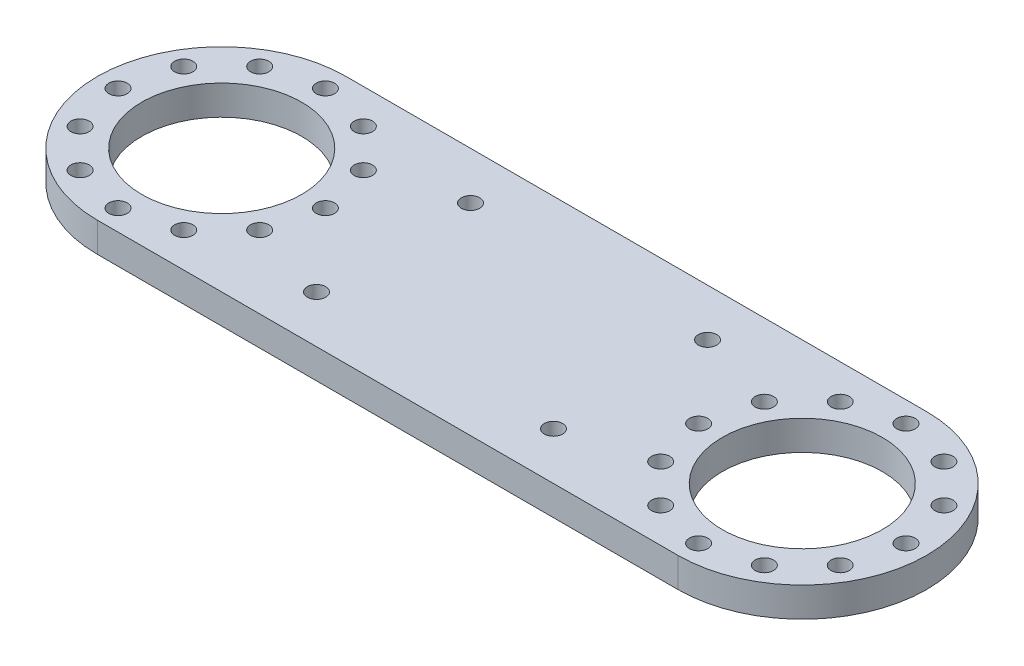
ISO-10303-21;
HEADER;
FILE_DESCRIPTION(('STEP AP214'),'2;1');
FILE_NAME('part.step','',(''),(''),'','','');
FILE_SCHEMA(('AUTOMOTIVE_DESIGN { 1 0 10303 214 1 1 1 1 }'));
ENDSEC;
DATA;
#1=APPLICATION_CONTEXT('core data for automotive mechanical design processes');
#2=APPLICATION_PROTOCOL_DEFINITION('international standard','automotive_design',2000,#1);
#3=PRODUCT_CONTEXT('',#1,'mechanical');
#4=PRODUCT('Part','Part','',(#3));
#5=PRODUCT_RELATED_PRODUCT_CATEGORY('part','',(#4));
#6=PRODUCT_DEFINITION_FORMATION('','',#4);
#7=PRODUCT_DEFINITION_CONTEXT('part definition',#1,'design');
#8=PRODUCT_DEFINITION('design','',#6,#7);
#9=PRODUCT_DEFINITION_SHAPE('','',#8);
#10=(LENGTH_UNIT() NAMED_UNIT(*) SI_UNIT(.MILLI.,.METRE.));
#11=(NAMED_UNIT(*) PLANE_ANGLE_UNIT() SI_UNIT($,.RADIAN.));
#12=(NAMED_UNIT(*) SI_UNIT($,.STERADIAN.) SOLID_ANGLE_UNIT());
#13=UNCERTAINTY_MEASURE_WITH_UNIT(LENGTH_MEASURE(1.E-05),#10,'distance_accuracy_value','');
#14=(GEOMETRIC_REPRESENTATION_CONTEXT(3) GLOBAL_UNCERTAINTY_ASSIGNED_CONTEXT((#13)) GLOBAL_UNIT_ASSIGNED_CONTEXT((#10,
#11,#12)) REPRESENTATION_CONTEXT('',''));
#15=CARTESIAN_POINT('',(0.,0.,0.));
#16=DIRECTION('',(0.,0.,1.));
#17=DIRECTION('',(1.,0.,0.));
#18=AXIS2_PLACEMENT_3D('',#15,#16,#17);
#19=CARTESIAN_POINT('',(-49.,5.,0.));
#20=DIRECTION('',(0.,1.,0.));
#21=DIRECTION('',(0.,0.,1.));
#22=AXIS2_PLACEMENT_3D('',#19,#20,#21);
#23=PLANE('',#22);
#24=CARTESIAN_POINT('',(49.,5.,0.));
#25=DIRECTION('',(0.,1.,0.));
#26=DIRECTION('',(0.,0.,-1.));
#27=AXIS2_PLACEMENT_3D('',#24,#25,#26);
#28=CIRCLE('',#27,13.5);
#29=CARTESIAN_POINT('',(49.,5.,-13.5));
#30=VERTEX_POINT('',#29);
#31=EDGE_CURVE('E281',#30,#30,#28,.T.);
#32=ORIENTED_EDGE('',*,*,#31,.F.);
#33=EDGE_LOOP('',(#32));
#34=FACE_BOUND('',#33,.T.);
#35=CARTESIAN_POINT('',(20.,5.,-13.));
#36=DIRECTION('',(0.,1.,0.));
#37=DIRECTION('',(0.,0.,-1.));
#38=AXIS2_PLACEMENT_3D('',#35,#36,#37);
#39=CIRCLE('',#38,1.55);
#40=CARTESIAN_POINT('',(20.,5.,-14.55));
#41=VERTEX_POINT('',#40);
#42=EDGE_CURVE('E269',#41,#41,#39,.T.);
#43=ORIENTED_EDGE('',*,*,#42,.F.);
#44=EDGE_LOOP('',(#43));
#45=FACE_BOUND('',#44,.T.);
#46=CARTESIAN_POINT('',(40.25,5.,-15.1554445662277));
#47=DIRECTION('',(0.,1.,0.));
#48=DIRECTION('',(0.,0.,-1.));
#49=AXIS2_PLACEMENT_3D('',#46,#47,#48);
#50=CIRCLE('',#49,1.55000000000001);
#51=CARTESIAN_POINT('',(40.25,5.,-16.7054445662277));
#52=VERTEX_POINT('',#51);
#53=EDGE_CURVE('E257',#52,#52,#50,.T.);
#54=ORIENTED_EDGE('',*,*,#53,.F.);
#55=EDGE_LOOP('',(#54));
#56=FACE_BOUND('',#55,.T.);
#57=CARTESIAN_POINT('',(33.8445554337723,5.,8.74999999999999));
#58=DIRECTION('',(0.,1.,0.));
#59=DIRECTION('',(0.,0.,-1.));
#60=AXIS2_PLACEMENT_3D('',#57,#58,#59);
#61=CIRCLE('',#60,1.55);
#62=CARTESIAN_POINT('',(33.8445554337723,5.,7.19999999999999));
#63=VERTEX_POINT('',#62);
#64=EDGE_CURVE('E245',#63,#63,#61,.T.);
#65=ORIENTED_EDGE('',*,*,#64,.F.);
#66=EDGE_LOOP('',(#65));
#67=FACE_BOUND('',#66,.T.);
#68=CARTESIAN_POINT('',(49.,5.,17.5));
#69=DIRECTION('',(0.,1.,0.));
#70=DIRECTION('',(0.,0.,-1.));
#71=AXIS2_PLACEMENT_3D('',#68,#69,#70);
#72=CIRCLE('',#71,1.54999999999999);
#73=CARTESIAN_POINT('',(49.,5.,15.95));
#74=VERTEX_POINT('',#73);
#75=EDGE_CURVE('E233',#74,#74,#72,.T.);
#76=ORIENTED_EDGE('',*,*,#75,.F.);
#77=EDGE_LOOP('',(#76));
#78=FACE_BOUND('',#77,.T.);
#79=CARTESIAN_POINT('',(64.1554445662277,5.,8.75000000000001));
#80=DIRECTION('',(0.,1.,0.));
#81=DIRECTION('',(0.,0.,-1.));
#82=AXIS2_PLACEMENT_3D('',#79,#80,#81);
#83=CIRCLE('',#82,1.55000000000001);
#84=CARTESIAN_POINT('',(64.1554445662277,5.,7.2));
#85=VERTEX_POINT('',#84);
#86=EDGE_CURVE('E221',#85,#85,#83,.T.);
#87=ORIENTED_EDGE('',*,*,#86,.F.);
#88=EDGE_LOOP('',(#87));
#89=FACE_BOUND('',#88,.T.);
#90=CARTESIAN_POINT('',(64.1554445662277,5.,-8.74999999999999));
#91=DIRECTION('',(0.,1.,0.));
#92=DIRECTION('',(0.,0.,-1.));
#93=AXIS2_PLACEMENT_3D('',#90,#91,#92);
#94=CIRCLE('',#93,1.55000000000001);
#95=CARTESIAN_POINT('',(64.1554445662277,5.,-10.3));
#96=VERTEX_POINT('',#95);
#97=EDGE_CURVE('E209',#96,#96,#94,.T.);
#98=ORIENTED_EDGE('',*,*,#97,.F.);
#99=EDGE_LOOP('',(#98));
#100=FACE_BOUND('',#99,.T.);
#101=CARTESIAN_POINT('',(-64.1554445662277,5.,-8.74999999999999));
#102=DIRECTION('',(0.,1.,0.));
#103=DIRECTION('',(0.,0.,1.));
#104=AXIS2_PLACEMENT_3D('',#101,#102,#103);
#105=CIRCLE('',#104,1.55000000000001);
#106=CARTESIAN_POINT('',(-64.1554445662277,5.,-7.19999999999998));
#107=VERTEX_POINT('',#106);
#108=EDGE_CURVE('E197',#107,#107,#105,.T.);
#109=ORIENTED_EDGE('',*,*,#108,.F.);
#110=EDGE_LOOP('',(#109));
#111=FACE_BOUND('',#110,.T.);
#112=CARTESIAN_POINT('',(-64.1554445662277,5.,8.75000000000001));
#113=DIRECTION('',(0.,1.,0.));
#114=DIRECTION('',(0.,0.,1.));
#115=AXIS2_PLACEMENT_3D('',#112,#113,#114);
#116=CIRCLE('',#115,1.55000000000001);
#117=CARTESIAN_POINT('',(-64.1554445662277,5.,10.3));
#118=VERTEX_POINT('',#117);
#119=EDGE_CURVE('E185',#118,#118,#116,.T.);
#120=ORIENTED_EDGE('',*,*,#119,.F.);
#121=EDGE_LOOP('',(#120));
#122=FACE_BOUND('',#121,.T.);
#123=CARTESIAN_POINT('',(-49.,5.,17.5));
#124=DIRECTION('',(0.,1.,0.));
#125=DIRECTION('',(0.,0.,1.));
#126=AXIS2_PLACEMENT_3D('',#123,#124,#125);
#127=CIRCLE('',#126,1.54999999999999);
#128=CARTESIAN_POINT('',(-49.,5.,19.05));
#129=VERTEX_POINT('',#128);
#130=EDGE_CURVE('E173',#129,#129,#127,.T.);
#131=ORIENTED_EDGE('',*,*,#130,.F.);
#132=EDGE_LOOP('',(#131));
#133=FACE_BOUND('',#132,.T.);
#134=CARTESIAN_POINT('',(-33.8445554337723,5.,8.74999999999999));
#135=DIRECTION('',(0.,1.,0.));
#136=DIRECTION('',(0.,0.,1.));
#137=AXIS2_PLACEMENT_3D('',#134,#135,#136);
#138=CIRCLE('',#137,1.55);
#139=CARTESIAN_POINT('',(-33.8445554337723,5.,10.3));
#140=VERTEX_POINT('',#139);
#141=EDGE_CURVE('E161',#140,#140,#138,.T.);
#142=ORIENTED_EDGE('',*,*,#141,.F.);
#143=EDGE_LOOP('',(#142));
#144=FACE_BOUND('',#143,.T.);
#145=CARTESIAN_POINT('',(-33.8445554337723,5.,-8.75000000000001));
#146=DIRECTION('',(0.,1.,0.));
#147=DIRECTION('',(0.,0.,1.));
#148=AXIS2_PLACEMENT_3D('',#145,#146,#147);
#149=CIRCLE('',#148,1.55);
#150=CARTESIAN_POINT('',(-33.8445554337723,5.,-7.20000000000001));
#151=VERTEX_POINT('',#150);
#152=EDGE_CURVE('E149',#151,#151,#149,.T.);
#153=ORIENTED_EDGE('',*,*,#152,.F.);
#154=EDGE_LOOP('',(#153));
#155=FACE_BOUND('',#154,.T.);
#156=CARTESIAN_POINT('',(57.75,5.,-15.1554445662277));
#157=DIRECTION('',(0.,1.,0.));
#158=DIRECTION('',(0.,0.,-1.));
#159=AXIS2_PLACEMENT_3D('',#156,#157,#158);
#160=CIRCLE('',#159,1.55);
#161=CARTESIAN_POINT('',(57.75,5.,-16.7054445662277));
#162=VERTEX_POINT('',#161);
#163=EDGE_CURVE('E137',#162,#162,#160,.T.);
#164=ORIENTED_EDGE('',*,*,#163,.F.);
#165=EDGE_LOOP('',(#164));
#166=FACE_BOUND('',#165,.T.);
#167=CARTESIAN_POINT('',(-20.,5.,-13.));
#168=DIRECTION('',(0.,1.,0.));
#169=DIRECTION('',(0.,0.,1.));
#170=AXIS2_PLACEMENT_3D('',#167,#168,#169);
#171=CIRCLE('',#170,1.55);
#172=CARTESIAN_POINT('',(-20.,5.,-11.45));
#173=VERTEX_POINT('',#172);
#174=EDGE_CURVE('E125',#173,#173,#171,.T.);
#175=ORIENTED_EDGE('',*,*,#174,.F.);
#176=EDGE_LOOP('',(#175));
#177=FACE_BOUND('',#176,.T.);
#178=CARTESIAN_POINT('',(-49.,5.,0.));
#179=DIRECTION('',(0.,1.,0.));
#180=DIRECTION('',(0.,0.,1.));
#181=AXIS2_PLACEMENT_3D('',#178,#179,#180);
#182=CIRCLE('',#181,13.5);
#183=CARTESIAN_POINT('',(-49.,5.,13.5));
#184=VERTEX_POINT('',#183);
#185=EDGE_CURVE('E104',#184,#184,#182,.T.);
#186=ORIENTED_EDGE('',*,*,#185,.F.);
#187=EDGE_LOOP('',(#186));
#188=FACE_BOUND('',#187,.T.);
#189=CARTESIAN_POINT('',(-49.,5.,0.));
#190=DIRECTION('',(0.,1.,0.));
#191=DIRECTION('',(0.,0.,1.));
#192=AXIS2_PLACEMENT_3D('',#189,#190,#191);
#193=CIRCLE('',#192,21.);
#194=CARTESIAN_POINT('',(-49.,5.,-21.));
#195=VERTEX_POINT('',#194);
#196=CARTESIAN_POINT('',(-49.,5.,21.));
#197=VERTEX_POINT('',#196);
#198=EDGE_CURVE('E89',#195,#197,#193,.T.);
#199=ORIENTED_EDGE('',*,*,#198,.T.);
#200=DIRECTION('',(1.,0.,0.));
#201=VECTOR('',#200,1.);
#202=CARTESIAN_POINT('',(-49.,5.,21.));
#203=LINE('',#202,#201);
#204=CARTESIAN_POINT('',(49.,5.,21.));
#205=VERTEX_POINT('',#204);
#206=EDGE_CURVE('E84',#197,#205,#203,.T.);
#207=ORIENTED_EDGE('',*,*,#206,.T.);
#208=CARTESIAN_POINT('',(49.,5.,0.));
#209=DIRECTION('',(0.,1.,0.));
#210=DIRECTION('',(0.,0.,1.));
#211=AXIS2_PLACEMENT_3D('',#208,#209,#210);
#212=CIRCLE('',#211,21.);
#213=CARTESIAN_POINT('',(49.,5.,-21.));
#214=VERTEX_POINT('',#213);
#215=EDGE_CURVE('E87',#205,#214,#212,.T.);
#216=ORIENTED_EDGE('',*,*,#215,.T.);
#217=DIRECTION('',(-1.,0.,0.));
#218=VECTOR('',#217,1.);
#219=CARTESIAN_POINT('',(-49.,5.,-21.));
#220=LINE('',#219,#218);
#221=EDGE_CURVE('E54',#214,#195,#220,.T.);
#222=ORIENTED_EDGE('',*,*,#221,.T.);
#223=EDGE_LOOP('',(#199,#207,#216,#222));
#224=FACE_BOUND('',#223,.T.);
#225=CARTESIAN_POINT('',(-49.,5.,-17.5));
#226=DIRECTION('',(0.,1.,0.));
#227=DIRECTION('',(0.,0.,1.));
#228=AXIS2_PLACEMENT_3D('',#225,#226,#227);
#229=CIRCLE('',#228,1.55);
#230=CARTESIAN_POINT('',(-49.,5.,-15.95));
#231=VERTEX_POINT('',#230);
#232=EDGE_CURVE('E119',#231,#231,#229,.T.);
#233=ORIENTED_EDGE('',*,*,#232,.F.);
#234=EDGE_LOOP('',(#233));
#235=FACE_BOUND('',#234,.T.);
#236=CARTESIAN_POINT('',(-20.,5.,13.));
#237=DIRECTION('',(0.,1.,0.));
#238=DIRECTION('',(0.,0.,1.));
#239=AXIS2_PLACEMENT_3D('',#236,#237,#238);
#240=CIRCLE('',#239,1.55);
#241=CARTESIAN_POINT('',(-20.,5.,14.55));
#242=VERTEX_POINT('',#241);
#243=EDGE_CURVE('E131',#242,#242,#240,.T.);
#244=ORIENTED_EDGE('',*,*,#243,.F.);
#245=EDGE_LOOP('',(#244));
#246=FACE_BOUND('',#245,.T.);
#247=CARTESIAN_POINT('',(-40.25,5.,-15.1554445662277));
#248=DIRECTION('',(0.,1.,0.));
#249=DIRECTION('',(0.,0.,1.));
#250=AXIS2_PLACEMENT_3D('',#247,#248,#249);
#251=CIRCLE('',#250,1.55000000000001);
#252=CARTESIAN_POINT('',(-40.25,5.,-13.6054445662277));
#253=VERTEX_POINT('',#252);
#254=EDGE_CURVE('E143',#253,#253,#251,.T.);
#255=ORIENTED_EDGE('',*,*,#254,.F.);
#256=EDGE_LOOP('',(#255));
#257=FACE_BOUND('',#256,.T.);
#258=CARTESIAN_POINT('',(-31.5,5.,0.));
#259=DIRECTION('',(0.,1.,0.));
#260=DIRECTION('',(0.,0.,1.));
#261=AXIS2_PLACEMENT_3D('',#258,#259,#260);
#262=CIRCLE('',#261,1.55);
#263=CARTESIAN_POINT('',(-31.5,5.,1.55));
#264=VERTEX_POINT('',#263);
#265=EDGE_CURVE('E155',#264,#264,#262,.T.);
#266=ORIENTED_EDGE('',*,*,#265,.F.);
#267=EDGE_LOOP('',(#266));
#268=FACE_BOUND('',#267,.T.);
#269=CARTESIAN_POINT('',(-40.25,5.,15.1554445662277));
#270=DIRECTION('',(0.,1.,0.));
#271=DIRECTION('',(0.,0.,1.));
#272=AXIS2_PLACEMENT_3D('',#269,#270,#271);
#273=CIRCLE('',#272,1.55);
#274=CARTESIAN_POINT('',(-40.25,5.,16.7054445662277));
#275=VERTEX_POINT('',#274);
#276=EDGE_CURVE('E167',#275,#275,#273,.T.);
#277=ORIENTED_EDGE('',*,*,#276,.F.);
#278=EDGE_LOOP('',(#277));
#279=FACE_BOUND('',#278,.T.);
#280=CARTESIAN_POINT('',(-57.75,5.,15.1554445662277));
#281=DIRECTION('',(0.,1.,0.));
#282=DIRECTION('',(0.,0.,1.));
#283=AXIS2_PLACEMENT_3D('',#280,#281,#282);
#284=CIRCLE('',#283,1.54999999999999);
#285=CARTESIAN_POINT('',(-57.75,5.,16.7054445662277));
#286=VERTEX_POINT('',#285);
#287=EDGE_CURVE('E179',#286,#286,#284,.T.);
#288=ORIENTED_EDGE('',*,*,#287,.F.);
#289=EDGE_LOOP('',(#288));
#290=FACE_BOUND('',#289,.T.);
#291=CARTESIAN_POINT('',(-66.5,5.,0.));
#292=DIRECTION('',(0.,1.,0.));
#293=DIRECTION('',(0.,0.,1.));
#294=AXIS2_PLACEMENT_3D('',#291,#292,#293);
#295=CIRCLE('',#294,1.54999999999999);
#296=CARTESIAN_POINT('',(-66.5,5.,1.54999999999999));
#297=VERTEX_POINT('',#296);
#298=EDGE_CURVE('E191',#297,#297,#295,.T.);
#299=ORIENTED_EDGE('',*,*,#298,.F.);
#300=EDGE_LOOP('',(#299));
#301=FACE_BOUND('',#300,.T.);
#302=CARTESIAN_POINT('',(-57.75,5.,-15.1554445662277));
#303=DIRECTION('',(0.,1.,0.));
#304=DIRECTION('',(0.,0.,1.));
#305=AXIS2_PLACEMENT_3D('',#302,#303,#304);
#306=CIRCLE('',#305,1.55);
#307=CARTESIAN_POINT('',(-57.75,5.,-13.6054445662277));
#308=VERTEX_POINT('',#307);
#309=EDGE_CURVE('E203',#308,#308,#306,.T.);
#310=ORIENTED_EDGE('',*,*,#309,.F.);
#311=EDGE_LOOP('',(#310));
#312=FACE_BOUND('',#311,.T.);
#313=CARTESIAN_POINT('',(66.5,5.,0.));
#314=DIRECTION('',(0.,1.,0.));
#315=DIRECTION('',(0.,0.,-1.));
#316=AXIS2_PLACEMENT_3D('',#313,#314,#315);
#317=CIRCLE('',#316,1.54999999999999);
#318=CARTESIAN_POINT('',(66.5,5.,-1.54999999999999));
#319=VERTEX_POINT('',#318);
#320=EDGE_CURVE('E215',#319,#319,#317,.T.);
#321=ORIENTED_EDGE('',*,*,#320,.F.);
#322=EDGE_LOOP('',(#321));
#323=FACE_BOUND('',#322,.T.);
#324=CARTESIAN_POINT('',(57.75,5.,15.1554445662277));
#325=DIRECTION('',(0.,1.,0.));
#326=DIRECTION('',(0.,0.,-1.));
#327=AXIS2_PLACEMENT_3D('',#324,#325,#326);
#328=CIRCLE('',#327,1.54999999999999);
#329=CARTESIAN_POINT('',(57.75,5.,13.6054445662277));
#330=VERTEX_POINT('',#329);
#331=EDGE_CURVE('E227',#330,#330,#328,.T.);
#332=ORIENTED_EDGE('',*,*,#331,.F.);
#333=EDGE_LOOP('',(#332));
#334=FACE_BOUND('',#333,.T.);
#335=CARTESIAN_POINT('',(40.25,5.,15.1554445662277));
#336=DIRECTION('',(0.,1.,0.));
#337=DIRECTION('',(0.,0.,-1.));
#338=AXIS2_PLACEMENT_3D('',#335,#336,#337);
#339=CIRCLE('',#338,1.55);
#340=CARTESIAN_POINT('',(40.25,5.,13.6054445662277));
#341=VERTEX_POINT('',#340);
#342=EDGE_CURVE('E239',#341,#341,#339,.T.);
#343=ORIENTED_EDGE('',*,*,#342,.F.);
#344=EDGE_LOOP('',(#343));
#345=FACE_BOUND('',#344,.T.);
#346=CARTESIAN_POINT('',(31.5,5.,0.));
#347=DIRECTION('',(0.,1.,0.));
#348=DIRECTION('',(0.,0.,-1.));
#349=AXIS2_PLACEMENT_3D('',#346,#347,#348);
#350=CIRCLE('',#349,1.54999999999999);
#351=CARTESIAN_POINT('',(31.5,5.,-1.54999999999999));
#352=VERTEX_POINT('',#351);
#353=EDGE_CURVE('E251',#352,#352,#350,.T.);
#354=ORIENTED_EDGE('',*,*,#353,.F.);
#355=EDGE_LOOP('',(#354));
#356=FACE_BOUND('',#355,.T.);
#357=CARTESIAN_POINT('',(20.,5.,13.));
#358=DIRECTION('',(0.,1.,0.));
#359=DIRECTION('',(0.,0.,-1.));
#360=AXIS2_PLACEMENT_3D('',#357,#358,#359);
#361=CIRCLE('',#360,1.55);
#362=CARTESIAN_POINT('',(20.,5.,11.45));
#363=VERTEX_POINT('',#362);
#364=EDGE_CURVE('E263',#363,#363,#361,.T.);
#365=ORIENTED_EDGE('',*,*,#364,.F.);
#366=EDGE_LOOP('',(#365));
#367=FACE_BOUND('',#366,.T.);
#368=CARTESIAN_POINT('',(49.,5.,-17.5));
#369=DIRECTION('',(0.,1.,0.));
#370=DIRECTION('',(0.,0.,-1.));
#371=AXIS2_PLACEMENT_3D('',#368,#369,#370);
#372=CIRCLE('',#371,1.55);
#373=CARTESIAN_POINT('',(49.,5.,-19.05));
#374=VERTEX_POINT('',#373);
#375=EDGE_CURVE('E275',#374,#374,#372,.T.);
#376=ORIENTED_EDGE('',*,*,#375,.F.);
#377=EDGE_LOOP('',(#376));
#378=FACE_BOUND('',#377,.T.);
#379=CARTESIAN_POINT('',(33.8445554337723,5.,-8.75000000000001));
#380=DIRECTION('',(0.,1.,0.));
#381=DIRECTION('',(0.,0.,-1.));
#382=AXIS2_PLACEMENT_3D('',#379,#380,#381);
#383=CIRCLE('',#382,1.55);
#384=CARTESIAN_POINT('',(33.8445554337723,5.,-10.3));
#385=VERTEX_POINT('',#384);
#386=EDGE_CURVE('E287',#385,#385,#383,.T.);
#387=ORIENTED_EDGE('',*,*,#386,.F.);
#388=EDGE_LOOP('',(#387));
#389=FACE_BOUND('',#388,.T.);
#390=ADVANCED_FACE('F37',(#34,#45,#56,#67,#78,#89,#100,#111,#122,#133,#144,#155,#166,#177,#188,
#224,#235,#246,#257,#268,#279,#290,#301,#312,#323,#334,#345,#356,#367,#378,#389),#23,.T.);
#391=CARTESIAN_POINT('',(-49.,0.,0.));
#392=DIRECTION('',(0.,1.,0.));
#393=DIRECTION('',(0.,0.,1.));
#394=AXIS2_PLACEMENT_3D('',#391,#392,#393);
#395=PLANE('',#394);
#396=CARTESIAN_POINT('',(-49.,0.,0.));
#397=DIRECTION('',(0.,1.,0.));
#398=DIRECTION('',(0.,0.,1.));
#399=AXIS2_PLACEMENT_3D('',#396,#397,#398);
#400=CIRCLE('',#399,21.);
#401=CARTESIAN_POINT('',(-49.,0.,-21.));
#402=VERTEX_POINT('',#401);
#403=CARTESIAN_POINT('',(-49.,0.,21.));
#404=VERTEX_POINT('',#403);
#405=EDGE_CURVE('E101',#402,#404,#400,.T.);
#406=ORIENTED_EDGE('',*,*,#405,.F.);
#407=DIRECTION('',(-1.,0.,0.));
#408=VECTOR('',#407,1.);
#409=CARTESIAN_POINT('',(-49.,0.,-21.));
#410=LINE('',#409,#408);
#411=CARTESIAN_POINT('',(49.,0.,-21.));
#412=VERTEX_POINT('',#411);
#413=EDGE_CURVE('E77',#412,#402,#410,.T.);
#414=ORIENTED_EDGE('',*,*,#413,.F.);
#415=CARTESIAN_POINT('',(49.,0.,0.));
#416=DIRECTION('',(0.,1.,0.));
#417=DIRECTION('',(0.,0.,1.));
#418=AXIS2_PLACEMENT_3D('',#415,#416,#417);
#419=CIRCLE('',#418,21.);
#420=CARTESIAN_POINT('',(49.,0.,21.));
#421=VERTEX_POINT('',#420);
#422=EDGE_CURVE('E71',#421,#412,#419,.T.);
#423=ORIENTED_EDGE('',*,*,#422,.F.);
#424=DIRECTION('',(1.,0.,0.));
#425=VECTOR('',#424,1.);
#426=CARTESIAN_POINT('',(-49.,0.,21.));
#427=LINE('',#426,#425);
#428=EDGE_CURVE('E93',#404,#421,#427,.T.);
#429=ORIENTED_EDGE('',*,*,#428,.F.);
#430=EDGE_LOOP('',(#406,#414,#423,#429));
#431=FACE_BOUND('',#430,.T.);
#432=CARTESIAN_POINT('',(-49.,0.,0.));
#433=DIRECTION('',(0.,1.,0.));
#434=DIRECTION('',(0.,0.,1.));
#435=AXIS2_PLACEMENT_3D('',#432,#433,#434);
#436=CIRCLE('',#435,13.5);
#437=CARTESIAN_POINT('',(-49.,0.,13.5));
#438=VERTEX_POINT('',#437);
#439=EDGE_CURVE('E116',#438,#438,#436,.T.);
#440=ORIENTED_EDGE('',*,*,#439,.T.);
#441=EDGE_LOOP('',(#440));
#442=FACE_BOUND('',#441,.T.);
#443=CARTESIAN_POINT('',(-49.,0.,-17.5));
#444=DIRECTION('',(0.,1.,0.));
#445=DIRECTION('',(0.,0.,1.));
#446=AXIS2_PLACEMENT_3D('',#443,#444,#445);
#447=CIRCLE('',#446,1.55);
#448=CARTESIAN_POINT('',(-49.,0.,-15.95));
#449=VERTEX_POINT('',#448);
#450=EDGE_CURVE('E122',#449,#449,#447,.T.);
#451=ORIENTED_EDGE('',*,*,#450,.T.);
#452=EDGE_LOOP('',(#451));
#453=FACE_BOUND('',#452,.T.);
#454=CARTESIAN_POINT('',(-20.,0.,-13.));
#455=DIRECTION('',(0.,1.,0.));
#456=DIRECTION('',(0.,0.,1.));
#457=AXIS2_PLACEMENT_3D('',#454,#455,#456);
#458=CIRCLE('',#457,1.55);
#459=CARTESIAN_POINT('',(-20.,0.,-11.45));
#460=VERTEX_POINT('',#459);
#461=EDGE_CURVE('E128',#460,#460,#458,.T.);
#462=ORIENTED_EDGE('',*,*,#461,.T.);
#463=EDGE_LOOP('',(#462));
#464=FACE_BOUND('',#463,.T.);
#465=CARTESIAN_POINT('',(-20.,0.,13.));
#466=DIRECTION('',(0.,1.,0.));
#467=DIRECTION('',(0.,0.,1.));
#468=AXIS2_PLACEMENT_3D('',#465,#466,#467);
#469=CIRCLE('',#468,1.55);
#470=CARTESIAN_POINT('',(-20.,0.,14.55));
#471=VERTEX_POINT('',#470);
#472=EDGE_CURVE('E134',#471,#471,#469,.T.);
#473=ORIENTED_EDGE('',*,*,#472,.T.);
#474=EDGE_LOOP('',(#473));
#475=FACE_BOUND('',#474,.T.);
#476=CARTESIAN_POINT('',(57.75,0.,-15.1554445662277));
#477=DIRECTION('',(0.,1.,0.));
#478=DIRECTION('',(0.,0.,-1.));
#479=AXIS2_PLACEMENT_3D('',#476,#477,#478);
#480=CIRCLE('',#479,1.55);
#481=CARTESIAN_POINT('',(57.75,0.,-16.7054445662277));
#482=VERTEX_POINT('',#481);
#483=EDGE_CURVE('E140',#482,#482,#480,.T.);
#484=ORIENTED_EDGE('',*,*,#483,.T.);
#485=EDGE_LOOP('',(#484));
#486=FACE_BOUND('',#485,.T.);
#487=CARTESIAN_POINT('',(-40.25,0.,-15.1554445662277));
#488=DIRECTION('',(0.,1.,0.));
#489=DIRECTION('',(0.,0.,1.));
#490=AXIS2_PLACEMENT_3D('',#487,#488,#489);
#491=CIRCLE('',#490,1.55000000000001);
#492=CARTESIAN_POINT('',(-40.25,0.,-13.6054445662277));
#493=VERTEX_POINT('',#492);
#494=EDGE_CURVE('E146',#493,#493,#491,.T.);
#495=ORIENTED_EDGE('',*,*,#494,.T.);
#496=EDGE_LOOP('',(#495));
#497=FACE_BOUND('',#496,.T.);
#498=CARTESIAN_POINT('',(-33.8445554337723,0.,-8.75000000000001));
#499=DIRECTION('',(0.,1.,0.));
#500=DIRECTION('',(0.,0.,1.));
#501=AXIS2_PLACEMENT_3D('',#498,#499,#500);
#502=CIRCLE('',#501,1.55);
#503=CARTESIAN_POINT('',(-33.8445554337723,0.,-7.20000000000001));
#504=VERTEX_POINT('',#503);
#505=EDGE_CURVE('E152',#504,#504,#502,.T.);
#506=ORIENTED_EDGE('',*,*,#505,.T.);
#507=EDGE_LOOP('',(#506));
#508=FACE_BOUND('',#507,.T.);
#509=CARTESIAN_POINT('',(-31.5,0.,0.));
#510=DIRECTION('',(0.,1.,0.));
#511=DIRECTION('',(0.,0.,1.));
#512=AXIS2_PLACEMENT_3D('',#509,#510,#511);
#513=CIRCLE('',#512,1.55);
#514=CARTESIAN_POINT('',(-31.5,0.,1.55));
#515=VERTEX_POINT('',#514);
#516=EDGE_CURVE('E158',#515,#515,#513,.T.);
#517=ORIENTED_EDGE('',*,*,#516,.T.);
#518=EDGE_LOOP('',(#517));
#519=FACE_BOUND('',#518,.T.);
#520=CARTESIAN_POINT('',(-33.8445554337723,0.,8.74999999999999));
#521=DIRECTION('',(0.,1.,0.));
#522=DIRECTION('',(0.,0.,1.));
#523=AXIS2_PLACEMENT_3D('',#520,#521,#522);
#524=CIRCLE('',#523,1.55);
#525=CARTESIAN_POINT('',(-33.8445554337723,0.,10.3));
#526=VERTEX_POINT('',#525);
#527=EDGE_CURVE('E164',#526,#526,#524,.T.);
#528=ORIENTED_EDGE('',*,*,#527,.T.);
#529=EDGE_LOOP('',(#528));
#530=FACE_BOUND('',#529,.T.);
#531=CARTESIAN_POINT('',(-40.25,0.,15.1554445662277));
#532=DIRECTION('',(0.,1.,0.));
#533=DIRECTION('',(0.,0.,1.));
#534=AXIS2_PLACEMENT_3D('',#531,#532,#533);
#535=CIRCLE('',#534,1.55);
#536=CARTESIAN_POINT('',(-40.25,0.,16.7054445662277));
#537=VERTEX_POINT('',#536);
#538=EDGE_CURVE('E170',#537,#537,#535,.T.);
#539=ORIENTED_EDGE('',*,*,#538,.T.);
#540=EDGE_LOOP('',(#539));
#541=FACE_BOUND('',#540,.T.);
#542=CARTESIAN_POINT('',(-49.,0.,17.5));
#543=DIRECTION('',(0.,1.,0.));
#544=DIRECTION('',(0.,0.,1.));
#545=AXIS2_PLACEMENT_3D('',#542,#543,#544);
#546=CIRCLE('',#545,1.54999999999999);
#547=CARTESIAN_POINT('',(-49.,0.,19.05));
#548=VERTEX_POINT('',#547);
#549=EDGE_CURVE('E176',#548,#548,#546,.T.);
#550=ORIENTED_EDGE('',*,*,#549,.T.);
#551=EDGE_LOOP('',(#550));
#552=FACE_BOUND('',#551,.T.);
#553=CARTESIAN_POINT('',(-57.75,0.,15.1554445662277));
#554=DIRECTION('',(0.,1.,0.));
#555=DIRECTION('',(0.,0.,1.));
#556=AXIS2_PLACEMENT_3D('',#553,#554,#555);
#557=CIRCLE('',#556,1.54999999999999);
#558=CARTESIAN_POINT('',(-57.75,0.,16.7054445662277));
#559=VERTEX_POINT('',#558);
#560=EDGE_CURVE('E182',#559,#559,#557,.T.);
#561=ORIENTED_EDGE('',*,*,#560,.T.);
#562=EDGE_LOOP('',(#561));
#563=FACE_BOUND('',#562,.T.);
#564=CARTESIAN_POINT('',(-64.1554445662277,0.,8.75000000000001));
#565=DIRECTION('',(0.,1.,0.));
#566=DIRECTION('',(0.,0.,1.));
#567=AXIS2_PLACEMENT_3D('',#564,#565,#566);
#568=CIRCLE('',#567,1.55000000000001);
#569=CARTESIAN_POINT('',(-64.1554445662277,0.,10.3));
#570=VERTEX_POINT('',#569);
#571=EDGE_CURVE('E188',#570,#570,#568,.T.);
#572=ORIENTED_EDGE('',*,*,#571,.T.);
#573=EDGE_LOOP('',(#572));
#574=FACE_BOUND('',#573,.T.);
#575=CARTESIAN_POINT('',(-66.5,0.,0.));
#576=DIRECTION('',(0.,1.,0.));
#577=DIRECTION('',(0.,0.,1.));
#578=AXIS2_PLACEMENT_3D('',#575,#576,#577);
#579=CIRCLE('',#578,1.54999999999999);
#580=CARTESIAN_POINT('',(-66.5,0.,1.54999999999999));
#581=VERTEX_POINT('',#580);
#582=EDGE_CURVE('E194',#581,#581,#579,.T.);
#583=ORIENTED_EDGE('',*,*,#582,.T.);
#584=EDGE_LOOP('',(#583));
#585=FACE_BOUND('',#584,.T.);
#586=CARTESIAN_POINT('',(-64.1554445662277,0.,-8.74999999999999));
#587=DIRECTION('',(0.,1.,0.));
#588=DIRECTION('',(0.,0.,1.));
#589=AXIS2_PLACEMENT_3D('',#586,#587,#588);
#590=CIRCLE('',#589,1.55000000000001);
#591=CARTESIAN_POINT('',(-64.1554445662277,0.,-7.19999999999998));
#592=VERTEX_POINT('',#591);
#593=EDGE_CURVE('E200',#592,#592,#590,.T.);
#594=ORIENTED_EDGE('',*,*,#593,.T.);
#595=EDGE_LOOP('',(#594));
#596=FACE_BOUND('',#595,.T.);
#597=CARTESIAN_POINT('',(-57.75,0.,-15.1554445662277));
#598=DIRECTION('',(0.,1.,0.));
#599=DIRECTION('',(0.,0.,1.));
#600=AXIS2_PLACEMENT_3D('',#597,#598,#599);
#601=CIRCLE('',#600,1.55);
#602=CARTESIAN_POINT('',(-57.75,0.,-13.6054445662277));
#603=VERTEX_POINT('',#602);
#604=EDGE_CURVE('E206',#603,#603,#601,.T.);
#605=ORIENTED_EDGE('',*,*,#604,.T.);
#606=EDGE_LOOP('',(#605));
#607=FACE_BOUND('',#606,.T.);
#608=CARTESIAN_POINT('',(64.1554445662277,0.,-8.74999999999999));
#609=DIRECTION('',(0.,1.,0.));
#610=DIRECTION('',(0.,0.,-1.));
#611=AXIS2_PLACEMENT_3D('',#608,#609,#610);
#612=CIRCLE('',#611,1.55000000000001);
#613=CARTESIAN_POINT('',(64.1554445662277,0.,-10.3));
#614=VERTEX_POINT('',#613);
#615=EDGE_CURVE('E212',#614,#614,#612,.T.);
#616=ORIENTED_EDGE('',*,*,#615,.T.);
#617=EDGE_LOOP('',(#616));
#618=FACE_BOUND('',#617,.T.);
#619=CARTESIAN_POINT('',(66.5,0.,0.));
#620=DIRECTION('',(0.,1.,0.));
#621=DIRECTION('',(0.,0.,-1.));
#622=AXIS2_PLACEMENT_3D('',#619,#620,#621);
#623=CIRCLE('',#622,1.54999999999999);
#624=CARTESIAN_POINT('',(66.5,0.,-1.54999999999999));
#625=VERTEX_POINT('',#624);
#626=EDGE_CURVE('E218',#625,#625,#623,.T.);
#627=ORIENTED_EDGE('',*,*,#626,.T.);
#628=EDGE_LOOP('',(#627));
#629=FACE_BOUND('',#628,.T.);
#630=CARTESIAN_POINT('',(64.1554445662277,0.,8.75000000000001));
#631=DIRECTION('',(0.,1.,0.));
#632=DIRECTION('',(0.,0.,-1.));
#633=AXIS2_PLACEMENT_3D('',#630,#631,#632);
#634=CIRCLE('',#633,1.55000000000001);
#635=CARTESIAN_POINT('',(64.1554445662277,0.,7.2));
#636=VERTEX_POINT('',#635);
#637=EDGE_CURVE('E224',#636,#636,#634,.T.);
#638=ORIENTED_EDGE('',*,*,#637,.T.);
#639=EDGE_LOOP('',(#638));
#640=FACE_BOUND('',#639,.T.);
#641=CARTESIAN_POINT('',(57.75,0.,15.1554445662277));
#642=DIRECTION('',(0.,1.,0.));
#643=DIRECTION('',(0.,0.,-1.));
#644=AXIS2_PLACEMENT_3D('',#641,#642,#643);
#645=CIRCLE('',#644,1.54999999999999);
#646=CARTESIAN_POINT('',(57.75,0.,13.6054445662277));
#647=VERTEX_POINT('',#646);
#648=EDGE_CURVE('E230',#647,#647,#645,.T.);
#649=ORIENTED_EDGE('',*,*,#648,.T.);
#650=EDGE_LOOP('',(#649));
#651=FACE_BOUND('',#650,.T.);
#652=CARTESIAN_POINT('',(49.,0.,17.5));
#653=DIRECTION('',(0.,1.,0.));
#654=DIRECTION('',(0.,0.,-1.));
#655=AXIS2_PLACEMENT_3D('',#652,#653,#654);
#656=CIRCLE('',#655,1.54999999999999);
#657=CARTESIAN_POINT('',(49.,0.,15.95));
#658=VERTEX_POINT('',#657);
#659=EDGE_CURVE('E236',#658,#658,#656,.T.);
#660=ORIENTED_EDGE('',*,*,#659,.T.);
#661=EDGE_LOOP('',(#660));
#662=FACE_BOUND('',#661,.T.);
#663=CARTESIAN_POINT('',(40.25,0.,15.1554445662277));
#664=DIRECTION('',(0.,1.,0.));
#665=DIRECTION('',(0.,0.,-1.));
#666=AXIS2_PLACEMENT_3D('',#663,#664,#665);
#667=CIRCLE('',#666,1.55);
#668=CARTESIAN_POINT('',(40.25,0.,13.6054445662277));
#669=VERTEX_POINT('',#668);
#670=EDGE_CURVE('E242',#669,#669,#667,.T.);
#671=ORIENTED_EDGE('',*,*,#670,.T.);
#672=EDGE_LOOP('',(#671));
#673=FACE_BOUND('',#672,.T.);
#674=CARTESIAN_POINT('',(33.8445554337723,0.,8.74999999999999));
#675=DIRECTION('',(0.,1.,0.));
#676=DIRECTION('',(0.,0.,-1.));
#677=AXIS2_PLACEMENT_3D('',#674,#675,#676);
#678=CIRCLE('',#677,1.55);
#679=CARTESIAN_POINT('',(33.8445554337723,0.,7.19999999999999));
#680=VERTEX_POINT('',#679);
#681=EDGE_CURVE('E248',#680,#680,#678,.T.);
#682=ORIENTED_EDGE('',*,*,#681,.T.);
#683=EDGE_LOOP('',(#682));
#684=FACE_BOUND('',#683,.T.);
#685=CARTESIAN_POINT('',(31.5,0.,0.));
#686=DIRECTION('',(0.,1.,0.));
#687=DIRECTION('',(0.,0.,-1.));
#688=AXIS2_PLACEMENT_3D('',#685,#686,#687);
#689=CIRCLE('',#688,1.54999999999999);
#690=CARTESIAN_POINT('',(31.5,0.,-1.54999999999999));
#691=VERTEX_POINT('',#690);
#692=EDGE_CURVE('E254',#691,#691,#689,.T.);
#693=ORIENTED_EDGE('',*,*,#692,.T.);
#694=EDGE_LOOP('',(#693));
#695=FACE_BOUND('',#694,.T.);
#696=CARTESIAN_POINT('',(40.25,0.,-15.1554445662277));
#697=DIRECTION('',(0.,1.,0.));
#698=DIRECTION('',(0.,0.,-1.));
#699=AXIS2_PLACEMENT_3D('',#696,#697,#698);
#700=CIRCLE('',#699,1.55000000000001);
#701=CARTESIAN_POINT('',(40.25,0.,-16.7054445662277));
#702=VERTEX_POINT('',#701);
#703=EDGE_CURVE('E260',#702,#702,#700,.T.);
#704=ORIENTED_EDGE('',*,*,#703,.T.);
#705=EDGE_LOOP('',(#704));
#706=FACE_BOUND('',#705,.T.);
#707=CARTESIAN_POINT('',(20.,0.,13.));
#708=DIRECTION('',(0.,1.,0.));
#709=DIRECTION('',(0.,0.,-1.));
#710=AXIS2_PLACEMENT_3D('',#707,#708,#709);
#711=CIRCLE('',#710,1.55);
#712=CARTESIAN_POINT('',(20.,0.,11.45));
#713=VERTEX_POINT('',#712);
#714=EDGE_CURVE('E266',#713,#713,#711,.T.);
#715=ORIENTED_EDGE('',*,*,#714,.T.);
#716=EDGE_LOOP('',(#715));
#717=FACE_BOUND('',#716,.T.);
#718=CARTESIAN_POINT('',(20.,0.,-13.));
#719=DIRECTION('',(0.,1.,0.));
#720=DIRECTION('',(0.,0.,-1.));
#721=AXIS2_PLACEMENT_3D('',#718,#719,#720);
#722=CIRCLE('',#721,1.55);
#723=CARTESIAN_POINT('',(20.,0.,-14.55));
#724=VERTEX_POINT('',#723);
#725=EDGE_CURVE('E272',#724,#724,#722,.T.);
#726=ORIENTED_EDGE('',*,*,#725,.T.);
#727=EDGE_LOOP('',(#726));
#728=FACE_BOUND('',#727,.T.);
#729=CARTESIAN_POINT('',(49.,0.,-17.5));
#730=DIRECTION('',(0.,1.,0.));
#731=DIRECTION('',(0.,0.,-1.));
#732=AXIS2_PLACEMENT_3D('',#729,#730,#731);
#733=CIRCLE('',#732,1.55);
#734=CARTESIAN_POINT('',(49.,0.,-19.05));
#735=VERTEX_POINT('',#734);
#736=EDGE_CURVE('E278',#735,#735,#733,.T.);
#737=ORIENTED_EDGE('',*,*,#736,.T.);
#738=EDGE_LOOP('',(#737));
#739=FACE_BOUND('',#738,.T.);
#740=CARTESIAN_POINT('',(49.,0.,0.));
#741=DIRECTION('',(0.,1.,0.));
#742=DIRECTION('',(0.,0.,-1.));
#743=AXIS2_PLACEMENT_3D('',#740,#741,#742);
#744=CIRCLE('',#743,13.5);
#745=CARTESIAN_POINT('',(49.,0.,-13.5));
#746=VERTEX_POINT('',#745);
#747=EDGE_CURVE('E284',#746,#746,#744,.T.);
#748=ORIENTED_EDGE('',*,*,#747,.T.);
#749=EDGE_LOOP('',(#748));
#750=FACE_BOUND('',#749,.T.);
#751=CARTESIAN_POINT('',(33.8445554337723,0.,-8.75000000000001));
#752=DIRECTION('',(0.,1.,0.));
#753=DIRECTION('',(0.,0.,-1.));
#754=AXIS2_PLACEMENT_3D('',#751,#752,#753);
#755=CIRCLE('',#754,1.55);
#756=CARTESIAN_POINT('',(33.8445554337723,0.,-10.3));
#757=VERTEX_POINT('',#756);
#758=EDGE_CURVE('E290',#757,#757,#755,.T.);
#759=ORIENTED_EDGE('',*,*,#758,.T.);
#760=EDGE_LOOP('',(#759));
#761=FACE_BOUND('',#760,.T.);
#762=ADVANCED_FACE('F112',(#431,#442,#453,#464,#475,#486,#497,#508,#519,#530,#541,#552,#563,
#574,#585,#596,#607,#618,#629,#640,#651,#662,#673,#684,#695,#706,#717,#728,#739,#750,#761),#395,.F.);
#763=CARTESIAN_POINT('',(-49.,5.,0.));
#764=DIRECTION('',(0.,-1.,0.));
#765=DIRECTION('',(0.,0.,-1.));
#766=AXIS2_PLACEMENT_3D('',#763,#764,#765);
#767=CYLINDRICAL_SURFACE('',#766,21.);
#768=ORIENTED_EDGE('',*,*,#405,.T.);
#769=DIRECTION('',(0.,-1.,0.));
#770=VECTOR('',#769,1.);
#771=CARTESIAN_POINT('',(-49.,5.,21.));
#772=LINE('',#771,#770);
#773=EDGE_CURVE('E11',#197,#404,#772,.T.);
#774=ORIENTED_EDGE('',*,*,#773,.F.);
#775=ORIENTED_EDGE('',*,*,#198,.F.);
#776=DIRECTION('',(0.,-1.,0.));
#777=VECTOR('',#776,1.);
#778=CARTESIAN_POINT('',(-49.,5.,-21.));
#779=LINE('',#778,#777);
#780=EDGE_CURVE('E97',#195,#402,#779,.T.);
#781=ORIENTED_EDGE('',*,*,#780,.T.);
#782=EDGE_LOOP('',(#768,#774,#775,#781));
#783=FACE_BOUND('',#782,.T.);
#784=ADVANCED_FACE('F39',(#783),#767,.T.);
#785=CARTESIAN_POINT('',(-49.,5.,21.));
#786=DIRECTION('',(0.,0.,-1.));
#787=DIRECTION('',(-1.,0.,0.));
#788=AXIS2_PLACEMENT_3D('',#785,#786,#787);
#789=PLANE('',#788);
#790=ORIENTED_EDGE('',*,*,#428,.T.);
#791=DIRECTION('',(0.,-1.,0.));
#792=VECTOR('',#791,1.);
#793=CARTESIAN_POINT('',(49.,5.,21.));
#794=LINE('',#793,#792);
#795=EDGE_CURVE('E46',#205,#421,#794,.T.);
#796=ORIENTED_EDGE('',*,*,#795,.F.);
#797=ORIENTED_EDGE('',*,*,#206,.F.);
#798=ORIENTED_EDGE('',*,*,#773,.T.);
#799=EDGE_LOOP('',(#790,#796,#797,#798));
#800=FACE_BOUND('',#799,.T.);
#801=ADVANCED_FACE('F92',(#800),#789,.F.);
#802=CARTESIAN_POINT('',(49.,5.,0.));
#803=DIRECTION('',(0.,-1.,0.));
#804=DIRECTION('',(0.,0.,-1.));
#805=AXIS2_PLACEMENT_3D('',#802,#803,#804);
#806=CYLINDRICAL_SURFACE('',#805,21.);
#807=ORIENTED_EDGE('',*,*,#422,.T.);
#808=DIRECTION('',(0.,-1.,0.));
#809=VECTOR('',#808,1.);
#810=CARTESIAN_POINT('',(49.,5.,-21.));
#811=LINE('',#810,#809);
#812=EDGE_CURVE('E94',#214,#412,#811,.T.);
#813=ORIENTED_EDGE('',*,*,#812,.F.);
#814=ORIENTED_EDGE('',*,*,#215,.F.);
#815=ORIENTED_EDGE('',*,*,#795,.T.);
#816=EDGE_LOOP('',(#807,#813,#814,#815));
#817=FACE_BOUND('',#816,.T.);
#818=ADVANCED_FACE('F95',(#817),#806,.T.);
#819=CARTESIAN_POINT('',(-49.,5.,-21.));
#820=DIRECTION('',(0.,0.,1.));
#821=DIRECTION('',(1.,0.,0.));
#822=AXIS2_PLACEMENT_3D('',#819,#820,#821);
#823=PLANE('',#822);
#824=ORIENTED_EDGE('',*,*,#413,.T.);
#825=ORIENTED_EDGE('',*,*,#780,.F.);
#826=ORIENTED_EDGE('',*,*,#221,.F.);
#827=ORIENTED_EDGE('',*,*,#812,.T.);
#828=EDGE_LOOP('',(#824,#825,#826,#827));
#829=FACE_BOUND('',#828,.T.);
#830=ADVANCED_FACE('F109',(#829),#823,.F.);
#831=CARTESIAN_POINT('',(-49.,5.,0.));
#832=DIRECTION('',(0.,-1.,0.));
#833=DIRECTION('',(0.,0.,-1.));
#834=AXIS2_PLACEMENT_3D('',#831,#832,#833);
#835=CYLINDRICAL_SURFACE('',#834,13.5);
#836=ORIENTED_EDGE('',*,*,#185,.T.);
#837=EDGE_LOOP('',(#836));
#838=FACE_BOUND('',#837,.T.);
#839=ORIENTED_EDGE('',*,*,#439,.F.);
#840=EDGE_LOOP('',(#839));
#841=FACE_BOUND('',#840,.T.);
#842=ADVANCED_FACE('F309',(#838,#841),#835,.F.);
#843=CARTESIAN_POINT('',(-49.,5.,-17.5));
#844=DIRECTION('',(0.,-1.,0.));
#845=DIRECTION('',(0.,0.,-1.));
#846=AXIS2_PLACEMENT_3D('',#843,#844,#845);
#847=CYLINDRICAL_SURFACE('',#846,1.55);
#848=ORIENTED_EDGE('',*,*,#232,.T.);
#849=EDGE_LOOP('',(#848));
#850=FACE_BOUND('',#849,.T.);
#851=ORIENTED_EDGE('',*,*,#450,.F.);
#852=EDGE_LOOP('',(#851));
#853=FACE_BOUND('',#852,.T.);
#854=ADVANCED_FACE('F355',(#850,#853),#847,.F.);
#855=CARTESIAN_POINT('',(-20.,5.,-13.));
#856=DIRECTION('',(0.,-1.,0.));
#857=DIRECTION('',(0.,0.,-1.));
#858=AXIS2_PLACEMENT_3D('',#855,#856,#857);
#859=CYLINDRICAL_SURFACE('',#858,1.55);
#860=ORIENTED_EDGE('',*,*,#174,.T.);
#861=EDGE_LOOP('',(#860));
#862=FACE_BOUND('',#861,.T.);
#863=ORIENTED_EDGE('',*,*,#461,.F.);
#864=EDGE_LOOP('',(#863));
#865=FACE_BOUND('',#864,.T.);
#866=ADVANCED_FACE('F363',(#862,#865),#859,.F.);
#867=CARTESIAN_POINT('',(-20.,5.,13.));
#868=DIRECTION('',(0.,-1.,0.));
#869=DIRECTION('',(0.,0.,-1.));
#870=AXIS2_PLACEMENT_3D('',#867,#868,#869);
#871=CYLINDRICAL_SURFACE('',#870,1.55);
#872=ORIENTED_EDGE('',*,*,#243,.T.);
#873=EDGE_LOOP('',(#872));
#874=FACE_BOUND('',#873,.T.);
#875=ORIENTED_EDGE('',*,*,#472,.F.);
#876=EDGE_LOOP('',(#875));
#877=FACE_BOUND('',#876,.T.);
#878=ADVANCED_FACE('F371',(#874,#877),#871,.F.);
#879=CARTESIAN_POINT('',(57.75,5.,-15.1554445662277));
#880=DIRECTION('',(0.,-1.,0.));
#881=DIRECTION('',(0.,0.,-1.));
#882=AXIS2_PLACEMENT_3D('',#879,#880,#881);
#883=CYLINDRICAL_SURFACE('',#882,1.55);
#884=ORIENTED_EDGE('',*,*,#163,.T.);
#885=EDGE_LOOP('',(#884));
#886=FACE_BOUND('',#885,.T.);
#887=ORIENTED_EDGE('',*,*,#483,.F.);
#888=EDGE_LOOP('',(#887));
#889=FACE_BOUND('',#888,.T.);
#890=ADVANCED_FACE('F380',(#886,#889),#883,.F.);
#891=CARTESIAN_POINT('',(-40.25,5.,-15.1554445662277));
#892=DIRECTION('',(0.,-1.,0.));
#893=DIRECTION('',(0.,0.,-1.));
#894=AXIS2_PLACEMENT_3D('',#891,#892,#893);
#895=CYLINDRICAL_SURFACE('',#894,1.55000000000001);
#896=ORIENTED_EDGE('',*,*,#254,.T.);
#897=EDGE_LOOP('',(#896));
#898=FACE_BOUND('',#897,.T.);
#899=ORIENTED_EDGE('',*,*,#494,.F.);
#900=EDGE_LOOP('',(#899));
#901=FACE_BOUND('',#900,.T.);
#902=ADVANCED_FACE('F389',(#898,#901),#895,.F.);
#903=CARTESIAN_POINT('',(-33.8445554337723,5.,-8.75000000000001));
#904=DIRECTION('',(0.,-1.,0.));
#905=DIRECTION('',(0.,0.,-1.));
#906=AXIS2_PLACEMENT_3D('',#903,#904,#905);
#907=CYLINDRICAL_SURFACE('',#906,1.55);
#908=ORIENTED_EDGE('',*,*,#152,.T.);
#909=EDGE_LOOP('',(#908));
#910=FACE_BOUND('',#909,.T.);
#911=ORIENTED_EDGE('',*,*,#505,.F.);
#912=EDGE_LOOP('',(#911));
#913=FACE_BOUND('',#912,.T.);
#914=ADVANCED_FACE('F398',(#910,#913),#907,.F.);
#915=CARTESIAN_POINT('',(-31.5,5.,0.));
#916=DIRECTION('',(0.,-1.,0.));
#917=DIRECTION('',(0.,0.,-1.));
#918=AXIS2_PLACEMENT_3D('',#915,#916,#917);
#919=CYLINDRICAL_SURFACE('',#918,1.55);
#920=ORIENTED_EDGE('',*,*,#265,.T.);
#921=EDGE_LOOP('',(#920));
#922=FACE_BOUND('',#921,.T.);
#923=ORIENTED_EDGE('',*,*,#516,.F.);
#924=EDGE_LOOP('',(#923));
#925=FACE_BOUND('',#924,.T.);
#926=ADVANCED_FACE('F407',(#922,#925),#919,.F.);
#927=CARTESIAN_POINT('',(-33.8445554337723,5.,8.74999999999999));
#928=DIRECTION('',(0.,-1.,0.));
#929=DIRECTION('',(0.,0.,-1.));
#930=AXIS2_PLACEMENT_3D('',#927,#928,#929);
#931=CYLINDRICAL_SURFACE('',#930,1.55);
#932=ORIENTED_EDGE('',*,*,#141,.T.);
#933=EDGE_LOOP('',(#932));
#934=FACE_BOUND('',#933,.T.);
#935=ORIENTED_EDGE('',*,*,#527,.F.);
#936=EDGE_LOOP('',(#935));
#937=FACE_BOUND('',#936,.T.);
#938=ADVANCED_FACE('F416',(#934,#937),#931,.F.);
#939=CARTESIAN_POINT('',(-40.25,5.,15.1554445662277));
#940=DIRECTION('',(0.,-1.,0.));
#941=DIRECTION('',(0.,0.,-1.));
#942=AXIS2_PLACEMENT_3D('',#939,#940,#941);
#943=CYLINDRICAL_SURFACE('',#942,1.55);
#944=ORIENTED_EDGE('',*,*,#276,.T.);
#945=EDGE_LOOP('',(#944));
#946=FACE_BOUND('',#945,.T.);
#947=ORIENTED_EDGE('',*,*,#538,.F.);
#948=EDGE_LOOP('',(#947));
#949=FACE_BOUND('',#948,.T.);
#950=ADVANCED_FACE('F425',(#946,#949),#943,.F.);
#951=CARTESIAN_POINT('',(-49.,5.,17.5));
#952=DIRECTION('',(0.,-1.,0.));
#953=DIRECTION('',(0.,0.,-1.));
#954=AXIS2_PLACEMENT_3D('',#951,#952,#953);
#955=CYLINDRICAL_SURFACE('',#954,1.54999999999999);
#956=ORIENTED_EDGE('',*,*,#130,.T.);
#957=EDGE_LOOP('',(#956));
#958=FACE_BOUND('',#957,.T.);
#959=ORIENTED_EDGE('',*,*,#549,.F.);
#960=EDGE_LOOP('',(#959));
#961=FACE_BOUND('',#960,.T.);
#962=ADVANCED_FACE('F434',(#958,#961),#955,.F.);
#963=CARTESIAN_POINT('',(-57.75,5.,15.1554445662277));
#964=DIRECTION('',(0.,-1.,0.));
#965=DIRECTION('',(0.,0.,-1.));
#966=AXIS2_PLACEMENT_3D('',#963,#964,#965);
#967=CYLINDRICAL_SURFACE('',#966,1.54999999999999);
#968=ORIENTED_EDGE('',*,*,#287,.T.);
#969=EDGE_LOOP('',(#968));
#970=FACE_BOUND('',#969,.T.);
#971=ORIENTED_EDGE('',*,*,#560,.F.);
#972=EDGE_LOOP('',(#971));
#973=FACE_BOUND('',#972,.T.);
#974=ADVANCED_FACE('F443',(#970,#973),#967,.F.);
#975=CARTESIAN_POINT('',(-64.1554445662277,5.,8.75000000000001));
#976=DIRECTION('',(0.,-1.,0.));
#977=DIRECTION('',(0.,0.,-1.));
#978=AXIS2_PLACEMENT_3D('',#975,#976,#977);
#979=CYLINDRICAL_SURFACE('',#978,1.55000000000001);
#980=ORIENTED_EDGE('',*,*,#119,.T.);
#981=EDGE_LOOP('',(#980));
#982=FACE_BOUND('',#981,.T.);
#983=ORIENTED_EDGE('',*,*,#571,.F.);
#984=EDGE_LOOP('',(#983));
#985=FACE_BOUND('',#984,.T.);
#986=ADVANCED_FACE('F452',(#982,#985),#979,.F.);
#987=CARTESIAN_POINT('',(-66.5,5.,0.));
#988=DIRECTION('',(0.,-1.,0.));
#989=DIRECTION('',(0.,0.,-1.));
#990=AXIS2_PLACEMENT_3D('',#987,#988,#989);
#991=CYLINDRICAL_SURFACE('',#990,1.54999999999999);
#992=ORIENTED_EDGE('',*,*,#298,.T.);
#993=EDGE_LOOP('',(#992));
#994=FACE_BOUND('',#993,.T.);
#995=ORIENTED_EDGE('',*,*,#582,.F.);
#996=EDGE_LOOP('',(#995));
#997=FACE_BOUND('',#996,.T.);
#998=ADVANCED_FACE('F461',(#994,#997),#991,.F.);
#999=CARTESIAN_POINT('',(-64.1554445662277,5.,-8.74999999999999));
#1000=DIRECTION('',(0.,-1.,0.));
#1001=DIRECTION('',(0.,0.,-1.));
#1002=AXIS2_PLACEMENT_3D('',#999,#1000,#1001);
#1003=CYLINDRICAL_SURFACE('',#1002,1.55000000000001);
#1004=ORIENTED_EDGE('',*,*,#108,.T.);
#1005=EDGE_LOOP('',(#1004));
#1006=FACE_BOUND('',#1005,.T.);
#1007=ORIENTED_EDGE('',*,*,#593,.F.);
#1008=EDGE_LOOP('',(#1007));
#1009=FACE_BOUND('',#1008,.T.);
#1010=ADVANCED_FACE('F470',(#1006,#1009),#1003,.F.);
#1011=CARTESIAN_POINT('',(-57.75,5.,-15.1554445662277));
#1012=DIRECTION('',(0.,-1.,0.));
#1013=DIRECTION('',(0.,0.,-1.));
#1014=AXIS2_PLACEMENT_3D('',#1011,#1012,#1013);
#1015=CYLINDRICAL_SURFACE('',#1014,1.55);
#1016=ORIENTED_EDGE('',*,*,#309,.T.);
#1017=EDGE_LOOP('',(#1016));
#1018=FACE_BOUND('',#1017,.T.);
#1019=ORIENTED_EDGE('',*,*,#604,.F.);
#1020=EDGE_LOOP('',(#1019));
#1021=FACE_BOUND('',#1020,.T.);
#1022=ADVANCED_FACE('F479',(#1018,#1021),#1015,.F.);
#1023=CARTESIAN_POINT('',(64.1554445662277,5.,-8.74999999999999));
#1024=DIRECTION('',(0.,-1.,0.));
#1025=DIRECTION('',(0.,0.,-1.));
#1026=AXIS2_PLACEMENT_3D('',#1023,#1024,#1025);
#1027=CYLINDRICAL_SURFACE('',#1026,1.55000000000001);
#1028=ORIENTED_EDGE('',*,*,#97,.T.);
#1029=EDGE_LOOP('',(#1028));
#1030=FACE_BOUND('',#1029,.T.);
#1031=ORIENTED_EDGE('',*,*,#615,.F.);
#1032=EDGE_LOOP('',(#1031));
#1033=FACE_BOUND('',#1032,.T.);
#1034=ADVANCED_FACE('F488',(#1030,#1033),#1027,.F.);
#1035=CARTESIAN_POINT('',(66.5,5.,0.));
#1036=DIRECTION('',(0.,-1.,0.));
#1037=DIRECTION('',(0.,0.,-1.));
#1038=AXIS2_PLACEMENT_3D('',#1035,#1036,#1037);
#1039=CYLINDRICAL_SURFACE('',#1038,1.54999999999999);
#1040=ORIENTED_EDGE('',*,*,#320,.T.);
#1041=EDGE_LOOP('',(#1040));
#1042=FACE_BOUND('',#1041,.T.);
#1043=ORIENTED_EDGE('',*,*,#626,.F.);
#1044=EDGE_LOOP('',(#1043));
#1045=FACE_BOUND('',#1044,.T.);
#1046=ADVANCED_FACE('F497',(#1042,#1045),#1039,.F.);
#1047=CARTESIAN_POINT('',(64.1554445662277,5.,8.75000000000001));
#1048=DIRECTION('',(0.,-1.,0.));
#1049=DIRECTION('',(0.,0.,-1.));
#1050=AXIS2_PLACEMENT_3D('',#1047,#1048,#1049);
#1051=CYLINDRICAL_SURFACE('',#1050,1.55000000000001);
#1052=ORIENTED_EDGE('',*,*,#86,.T.);
#1053=EDGE_LOOP('',(#1052));
#1054=FACE_BOUND('',#1053,.T.);
#1055=ORIENTED_EDGE('',*,*,#637,.F.);
#1056=EDGE_LOOP('',(#1055));
#1057=FACE_BOUND('',#1056,.T.);
#1058=ADVANCED_FACE('F506',(#1054,#1057),#1051,.F.);
#1059=CARTESIAN_POINT('',(57.75,5.,15.1554445662277));
#1060=DIRECTION('',(0.,-1.,0.));
#1061=DIRECTION('',(0.,0.,-1.));
#1062=AXIS2_PLACEMENT_3D('',#1059,#1060,#1061);
#1063=CYLINDRICAL_SURFACE('',#1062,1.54999999999999);
#1064=ORIENTED_EDGE('',*,*,#331,.T.);
#1065=EDGE_LOOP('',(#1064));
#1066=FACE_BOUND('',#1065,.T.);
#1067=ORIENTED_EDGE('',*,*,#648,.F.);
#1068=EDGE_LOOP('',(#1067));
#1069=FACE_BOUND('',#1068,.T.);
#1070=ADVANCED_FACE('F515',(#1066,#1069),#1063,.F.);
#1071=CARTESIAN_POINT('',(49.,5.,17.5));
#1072=DIRECTION('',(0.,-1.,0.));
#1073=DIRECTION('',(0.,0.,-1.));
#1074=AXIS2_PLACEMENT_3D('',#1071,#1072,#1073);
#1075=CYLINDRICAL_SURFACE('',#1074,1.54999999999999);
#1076=ORIENTED_EDGE('',*,*,#75,.T.);
#1077=EDGE_LOOP('',(#1076));
#1078=FACE_BOUND('',#1077,.T.);
#1079=ORIENTED_EDGE('',*,*,#659,.F.);
#1080=EDGE_LOOP('',(#1079));
#1081=FACE_BOUND('',#1080,.T.);
#1082=ADVANCED_FACE('F524',(#1078,#1081),#1075,.F.);
#1083=CARTESIAN_POINT('',(40.25,5.,15.1554445662277));
#1084=DIRECTION('',(0.,-1.,0.));
#1085=DIRECTION('',(0.,0.,-1.));
#1086=AXIS2_PLACEMENT_3D('',#1083,#1084,#1085);
#1087=CYLINDRICAL_SURFACE('',#1086,1.55);
#1088=ORIENTED_EDGE('',*,*,#342,.T.);
#1089=EDGE_LOOP('',(#1088));
#1090=FACE_BOUND('',#1089,.T.);
#1091=ORIENTED_EDGE('',*,*,#670,.F.);
#1092=EDGE_LOOP('',(#1091));
#1093=FACE_BOUND('',#1092,.T.);
#1094=ADVANCED_FACE('F533',(#1090,#1093),#1087,.F.);
#1095=CARTESIAN_POINT('',(33.8445554337723,5.,8.74999999999999));
#1096=DIRECTION('',(0.,-1.,0.));
#1097=DIRECTION('',(0.,0.,-1.));
#1098=AXIS2_PLACEMENT_3D('',#1095,#1096,#1097);
#1099=CYLINDRICAL_SURFACE('',#1098,1.55);
#1100=ORIENTED_EDGE('',*,*,#64,.T.);
#1101=EDGE_LOOP('',(#1100));
#1102=FACE_BOUND('',#1101,.T.);
#1103=ORIENTED_EDGE('',*,*,#681,.F.);
#1104=EDGE_LOOP('',(#1103));
#1105=FACE_BOUND('',#1104,.T.);
#1106=ADVANCED_FACE('F542',(#1102,#1105),#1099,.F.);
#1107=CARTESIAN_POINT('',(31.5,5.,0.));
#1108=DIRECTION('',(0.,-1.,0.));
#1109=DIRECTION('',(0.,0.,-1.));
#1110=AXIS2_PLACEMENT_3D('',#1107,#1108,#1109);
#1111=CYLINDRICAL_SURFACE('',#1110,1.54999999999999);
#1112=ORIENTED_EDGE('',*,*,#353,.T.);
#1113=EDGE_LOOP('',(#1112));
#1114=FACE_BOUND('',#1113,.T.);
#1115=ORIENTED_EDGE('',*,*,#692,.F.);
#1116=EDGE_LOOP('',(#1115));
#1117=FACE_BOUND('',#1116,.T.);
#1118=ADVANCED_FACE('F551',(#1114,#1117),#1111,.F.);
#1119=CARTESIAN_POINT('',(40.25,5.,-15.1554445662277));
#1120=DIRECTION('',(0.,-1.,0.));
#1121=DIRECTION('',(0.,0.,-1.));
#1122=AXIS2_PLACEMENT_3D('',#1119,#1120,#1121);
#1123=CYLINDRICAL_SURFACE('',#1122,1.55000000000001);
#1124=ORIENTED_EDGE('',*,*,#53,.T.);
#1125=EDGE_LOOP('',(#1124));
#1126=FACE_BOUND('',#1125,.T.);
#1127=ORIENTED_EDGE('',*,*,#703,.F.);
#1128=EDGE_LOOP('',(#1127));
#1129=FACE_BOUND('',#1128,.T.);
#1130=ADVANCED_FACE('F560',(#1126,#1129),#1123,.F.);
#1131=CARTESIAN_POINT('',(20.,5.,13.));
#1132=DIRECTION('',(0.,-1.,0.));
#1133=DIRECTION('',(0.,0.,-1.));
#1134=AXIS2_PLACEMENT_3D('',#1131,#1132,#1133);
#1135=CYLINDRICAL_SURFACE('',#1134,1.55);
#1136=ORIENTED_EDGE('',*,*,#364,.T.);
#1137=EDGE_LOOP('',(#1136));
#1138=FACE_BOUND('',#1137,.T.);
#1139=ORIENTED_EDGE('',*,*,#714,.F.);
#1140=EDGE_LOOP('',(#1139));
#1141=FACE_BOUND('',#1140,.T.);
#1142=ADVANCED_FACE('F569',(#1138,#1141),#1135,.F.);
#1143=CARTESIAN_POINT('',(20.,5.,-13.));
#1144=DIRECTION('',(0.,-1.,0.));
#1145=DIRECTION('',(0.,0.,-1.));
#1146=AXIS2_PLACEMENT_3D('',#1143,#1144,#1145);
#1147=CYLINDRICAL_SURFACE('',#1146,1.55);
#1148=ORIENTED_EDGE('',*,*,#42,.T.);
#1149=EDGE_LOOP('',(#1148));
#1150=FACE_BOUND('',#1149,.T.);
#1151=ORIENTED_EDGE('',*,*,#725,.F.);
#1152=EDGE_LOOP('',(#1151));
#1153=FACE_BOUND('',#1152,.T.);
#1154=ADVANCED_FACE('F578',(#1150,#1153),#1147,.F.);
#1155=CARTESIAN_POINT('',(49.,5.,-17.5));
#1156=DIRECTION('',(0.,-1.,0.));
#1157=DIRECTION('',(0.,0.,-1.));
#1158=AXIS2_PLACEMENT_3D('',#1155,#1156,#1157);
#1159=CYLINDRICAL_SURFACE('',#1158,1.55);
#1160=ORIENTED_EDGE('',*,*,#375,.T.);
#1161=EDGE_LOOP('',(#1160));
#1162=FACE_BOUND('',#1161,.T.);
#1163=ORIENTED_EDGE('',*,*,#736,.F.);
#1164=EDGE_LOOP('',(#1163));
#1165=FACE_BOUND('',#1164,.T.);
#1166=ADVANCED_FACE('F587',(#1162,#1165),#1159,.F.);
#1167=CARTESIAN_POINT('',(49.,5.,0.));
#1168=DIRECTION('',(0.,-1.,0.));
#1169=DIRECTION('',(0.,0.,-1.));
#1170=AXIS2_PLACEMENT_3D('',#1167,#1168,#1169);
#1171=CYLINDRICAL_SURFACE('',#1170,13.5);
#1172=ORIENTED_EDGE('',*,*,#31,.T.);
#1173=EDGE_LOOP('',(#1172));
#1174=FACE_BOUND('',#1173,.T.);
#1175=ORIENTED_EDGE('',*,*,#747,.F.);
#1176=EDGE_LOOP('',(#1175));
#1177=FACE_BOUND('',#1176,.T.);
#1178=ADVANCED_FACE('F596',(#1174,#1177),#1171,.F.);
#1179=CARTESIAN_POINT('',(33.8445554337723,5.,-8.75000000000001));
#1180=DIRECTION('',(0.,-1.,0.));
#1181=DIRECTION('',(0.,0.,-1.));
#1182=AXIS2_PLACEMENT_3D('',#1179,#1180,#1181);
#1183=CYLINDRICAL_SURFACE('',#1182,1.55);
#1184=ORIENTED_EDGE('',*,*,#386,.T.);
#1185=EDGE_LOOP('',(#1184));
#1186=FACE_BOUND('',#1185,.T.);
#1187=ORIENTED_EDGE('',*,*,#758,.F.);
#1188=EDGE_LOOP('',(#1187));
#1189=FACE_BOUND('',#1188,.T.);
#1190=ADVANCED_FACE('F296',(#1186,#1189),#1183,.F.);
#1191=CLOSED_SHELL('',(#390,#762,#784,#801,#818,#830,#842,#854,#866,#878,#890,#902,#914,#926,
#938,#950,#962,#974,#986,#998,#1010,#1022,#1034,#1046,#1058,#1070,#1082,#1094,#1106,#1118,#1130,
#1142,#1154,#1166,#1178,#1190));
#1192=MANIFOLD_SOLID_BREP('B2',#1191);
#1193=ADVANCED_BREP_SHAPE_REPRESENTATION('',(#18,#1192),#14);
#1194=SHAPE_DEFINITION_REPRESENTATION(#9,#1193);
ENDSEC;
END-ISO-10303-21;
